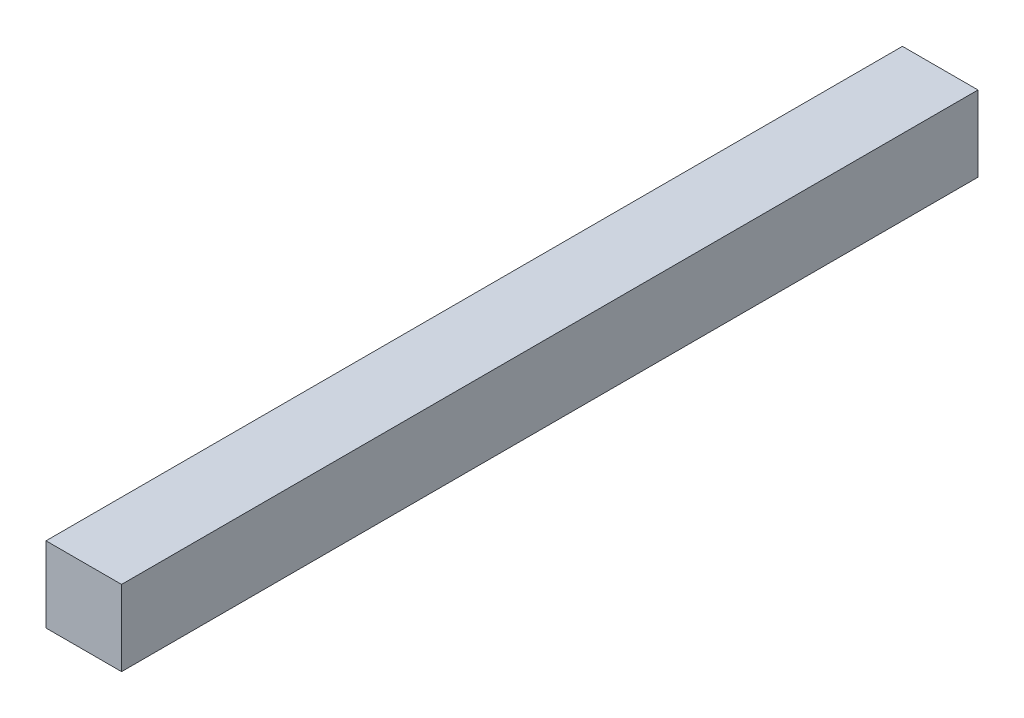
ISO-10303-21;
HEADER;
FILE_DESCRIPTION(('STEP AP214'),'2;1');
FILE_NAME('part.step','',(''),(''),'','','');
FILE_SCHEMA(('AUTOMOTIVE_DESIGN { 1 0 10303 214 1 1 1 1 }'));
ENDSEC;
DATA;
#1=APPLICATION_CONTEXT('core data for automotive mechanical design processes');
#2=APPLICATION_PROTOCOL_DEFINITION('international standard','automotive_design',2000,#1);
#3=PRODUCT_CONTEXT('',#1,'mechanical');
#4=PRODUCT('Part','Part','',(#3));
#5=PRODUCT_RELATED_PRODUCT_CATEGORY('part','',(#4));
#6=PRODUCT_DEFINITION_FORMATION('','',#4);
#7=PRODUCT_DEFINITION_CONTEXT('part definition',#1,'design');
#8=PRODUCT_DEFINITION('design','',#6,#7);
#9=PRODUCT_DEFINITION_SHAPE('','',#8);
#10=(LENGTH_UNIT() NAMED_UNIT(*) SI_UNIT(.MILLI.,.METRE.));
#11=(NAMED_UNIT(*) PLANE_ANGLE_UNIT() SI_UNIT($,.RADIAN.));
#12=(NAMED_UNIT(*) SI_UNIT($,.STERADIAN.) SOLID_ANGLE_UNIT());
#13=UNCERTAINTY_MEASURE_WITH_UNIT(LENGTH_MEASURE(1.E-05),#10,'distance_accuracy_value','');
#14=(GEOMETRIC_REPRESENTATION_CONTEXT(3) GLOBAL_UNCERTAINTY_ASSIGNED_CONTEXT((#13)) GLOBAL_UNIT_ASSIGNED_CONTEXT((#10,
#11,#12)) REPRESENTATION_CONTEXT('',''));
#15=CARTESIAN_POINT('',(0.,0.,0.));
#16=DIRECTION('',(0.,0.,1.));
#17=DIRECTION('',(1.,0.,0.));
#18=AXIS2_PLACEMENT_3D('',#15,#16,#17);
#19=CARTESIAN_POINT('',(15.,15.,340.));
#20=DIRECTION('',(-1.,0.,0.));
#21=DIRECTION('',(0.,-1.,0.));
#22=AXIS2_PLACEMENT_3D('',#19,#20,#21);
#23=PLANE('',#22);
#24=DIRECTION('',(0.,1.,0.));
#25=VECTOR('',#24,1.);
#26=CARTESIAN_POINT('',(15.,15.,0.));
#27=LINE('',#26,#25);
#28=CARTESIAN_POINT('',(15.,-15.,0.));
#29=VERTEX_POINT('',#28);
#30=CARTESIAN_POINT('',(15.,15.,0.));
#31=VERTEX_POINT('',#30);
#32=EDGE_CURVE('E98',#29,#31,#27,.T.);
#33=ORIENTED_EDGE('',*,*,#32,.T.);
#34=DIRECTION('',(0.,0.,-1.));
#35=VECTOR('',#34,1.);
#36=CARTESIAN_POINT('',(15.,15.,340.));
#37=LINE('',#36,#35);
#38=CARTESIAN_POINT('',(15.,15.,340.));
#39=VERTEX_POINT('',#38);
#40=EDGE_CURVE('E11',#39,#31,#37,.T.);
#41=ORIENTED_EDGE('',*,*,#40,.F.);
#42=DIRECTION('',(0.,1.,0.));
#43=VECTOR('',#42,1.);
#44=CARTESIAN_POINT('',(15.,15.,340.));
#45=LINE('',#44,#43);
#46=CARTESIAN_POINT('',(15.,-15.,340.));
#47=VERTEX_POINT('',#46);
#48=EDGE_CURVE('E86',#47,#39,#45,.T.);
#49=ORIENTED_EDGE('',*,*,#48,.F.);
#50=DIRECTION('',(0.,0.,-1.));
#51=VECTOR('',#50,1.);
#52=CARTESIAN_POINT('',(15.,-15.,340.));
#53=LINE('',#52,#51);
#54=EDGE_CURVE('E94',#47,#29,#53,.T.);
#55=ORIENTED_EDGE('',*,*,#54,.T.);
#56=EDGE_LOOP('',(#33,#41,#49,#55));
#57=FACE_BOUND('',#56,.T.);
#58=ADVANCED_FACE('F35',(#57),#23,.F.);
#59=CARTESIAN_POINT('',(-15.,15.,340.));
#60=DIRECTION('',(0.,-1.,0.));
#61=DIRECTION('',(0.,0.,-1.));
#62=AXIS2_PLACEMENT_3D('',#59,#60,#61);
#63=PLANE('',#62);
#64=DIRECTION('',(-1.,0.,0.));
#65=VECTOR('',#64,1.);
#66=CARTESIAN_POINT('',(-15.,15.,0.));
#67=LINE('',#66,#65);
#68=CARTESIAN_POINT('',(-15.,15.,0.));
#69=VERTEX_POINT('',#68);
#70=EDGE_CURVE('E90',#31,#69,#67,.T.);
#71=ORIENTED_EDGE('',*,*,#70,.T.);
#72=DIRECTION('',(0.,0.,-1.));
#73=VECTOR('',#72,1.);
#74=CARTESIAN_POINT('',(-15.,15.,340.));
#75=LINE('',#74,#73);
#76=CARTESIAN_POINT('',(-15.,15.,340.));
#77=VERTEX_POINT('',#76);
#78=EDGE_CURVE('E43',#77,#69,#75,.T.);
#79=ORIENTED_EDGE('',*,*,#78,.F.);
#80=DIRECTION('',(-1.,0.,0.));
#81=VECTOR('',#80,1.);
#82=CARTESIAN_POINT('',(-15.,15.,340.));
#83=LINE('',#82,#81);
#84=EDGE_CURVE('E81',#39,#77,#83,.T.);
#85=ORIENTED_EDGE('',*,*,#84,.F.);
#86=ORIENTED_EDGE('',*,*,#40,.T.);
#87=EDGE_LOOP('',(#71,#79,#85,#86));
#88=FACE_BOUND('',#87,.T.);
#89=ADVANCED_FACE('F89',(#88),#63,.F.);
#90=CARTESIAN_POINT('',(-15.,15.,340.));
#91=DIRECTION('',(1.,0.,0.));
#92=DIRECTION('',(0.,1.,0.));
#93=AXIS2_PLACEMENT_3D('',#90,#91,#92);
#94=PLANE('',#93);
#95=DIRECTION('',(0.,-1.,0.));
#96=VECTOR('',#95,1.);
#97=CARTESIAN_POINT('',(-15.,15.,0.));
#98=LINE('',#97,#96);
#99=CARTESIAN_POINT('',(-15.,-15.,0.));
#100=VERTEX_POINT('',#99);
#101=EDGE_CURVE('E68',#69,#100,#98,.T.);
#102=ORIENTED_EDGE('',*,*,#101,.T.);
#103=DIRECTION('',(0.,0.,-1.));
#104=VECTOR('',#103,1.);
#105=CARTESIAN_POINT('',(-15.,-15.,340.));
#106=LINE('',#105,#104);
#107=CARTESIAN_POINT('',(-15.,-15.,340.));
#108=VERTEX_POINT('',#107);
#109=EDGE_CURVE('E91',#108,#100,#106,.T.);
#110=ORIENTED_EDGE('',*,*,#109,.F.);
#111=DIRECTION('',(0.,-1.,0.));
#112=VECTOR('',#111,1.);
#113=CARTESIAN_POINT('',(-15.,15.,340.));
#114=LINE('',#113,#112);
#115=EDGE_CURVE('E84',#77,#108,#114,.T.);
#116=ORIENTED_EDGE('',*,*,#115,.F.);
#117=ORIENTED_EDGE('',*,*,#78,.T.);
#118=EDGE_LOOP('',(#102,#110,#116,#117));
#119=FACE_BOUND('',#118,.T.);
#120=ADVANCED_FACE('F92',(#119),#94,.F.);
#121=CARTESIAN_POINT('',(-15.,-15.,340.));
#122=DIRECTION('',(0.,1.,0.));
#123=DIRECTION('',(0.,0.,1.));
#124=AXIS2_PLACEMENT_3D('',#121,#122,#123);
#125=PLANE('',#124);
#126=DIRECTION('',(1.,0.,0.));
#127=VECTOR('',#126,1.);
#128=CARTESIAN_POINT('',(-15.,-15.,0.));
#129=LINE('',#128,#127);
#130=EDGE_CURVE('E74',#100,#29,#129,.T.);
#131=ORIENTED_EDGE('',*,*,#130,.T.);
#132=ORIENTED_EDGE('',*,*,#54,.F.);
#133=DIRECTION('',(1.,0.,0.));
#134=VECTOR('',#133,1.);
#135=CARTESIAN_POINT('',(-15.,-15.,340.));
#136=LINE('',#135,#134);
#137=EDGE_CURVE('E51',#108,#47,#136,.T.);
#138=ORIENTED_EDGE('',*,*,#137,.F.);
#139=ORIENTED_EDGE('',*,*,#109,.T.);
#140=EDGE_LOOP('',(#131,#132,#138,#139));
#141=FACE_BOUND('',#140,.T.);
#142=ADVANCED_FACE('F105',(#141),#125,.F.);
#143=CARTESIAN_POINT('',(0.,0.,340.));
#144=DIRECTION('',(0.,0.,1.));
#145=DIRECTION('',(1.,0.,0.));
#146=AXIS2_PLACEMENT_3D('',#143,#144,#145);
#147=PLANE('',#146);
#148=ORIENTED_EDGE('',*,*,#48,.T.);
#149=ORIENTED_EDGE('',*,*,#84,.T.);
#150=ORIENTED_EDGE('',*,*,#115,.T.);
#151=ORIENTED_EDGE('',*,*,#137,.T.);
#152=EDGE_LOOP('',(#148,#149,#150,#151));
#153=FACE_BOUND('',#152,.T.);
#154=ADVANCED_FACE('F82',(#153),#147,.T.);
#155=CARTESIAN_POINT('',(0.,0.,0.));
#156=DIRECTION('',(0.,0.,1.));
#157=DIRECTION('',(1.,0.,0.));
#158=AXIS2_PLACEMENT_3D('',#155,#156,#157);
#159=PLANE('',#158);
#160=ORIENTED_EDGE('',*,*,#32,.F.);
#161=ORIENTED_EDGE('',*,*,#130,.F.);
#162=ORIENTED_EDGE('',*,*,#101,.F.);
#163=ORIENTED_EDGE('',*,*,#70,.F.);
#164=EDGE_LOOP('',(#160,#161,#162,#163));
#165=FACE_BOUND('',#164,.T.);
#166=ADVANCED_FACE('F108',(#165),#159,.F.);
#167=CLOSED_SHELL('',(#58,#89,#120,#142,#154,#166));
#168=MANIFOLD_SOLID_BREP('B2',#167);
#169=ADVANCED_BREP_SHAPE_REPRESENTATION('',(#18,#168),#14);
#170=SHAPE_DEFINITION_REPRESENTATION(#9,#169);
ENDSEC;
END-ISO-10303-21;
